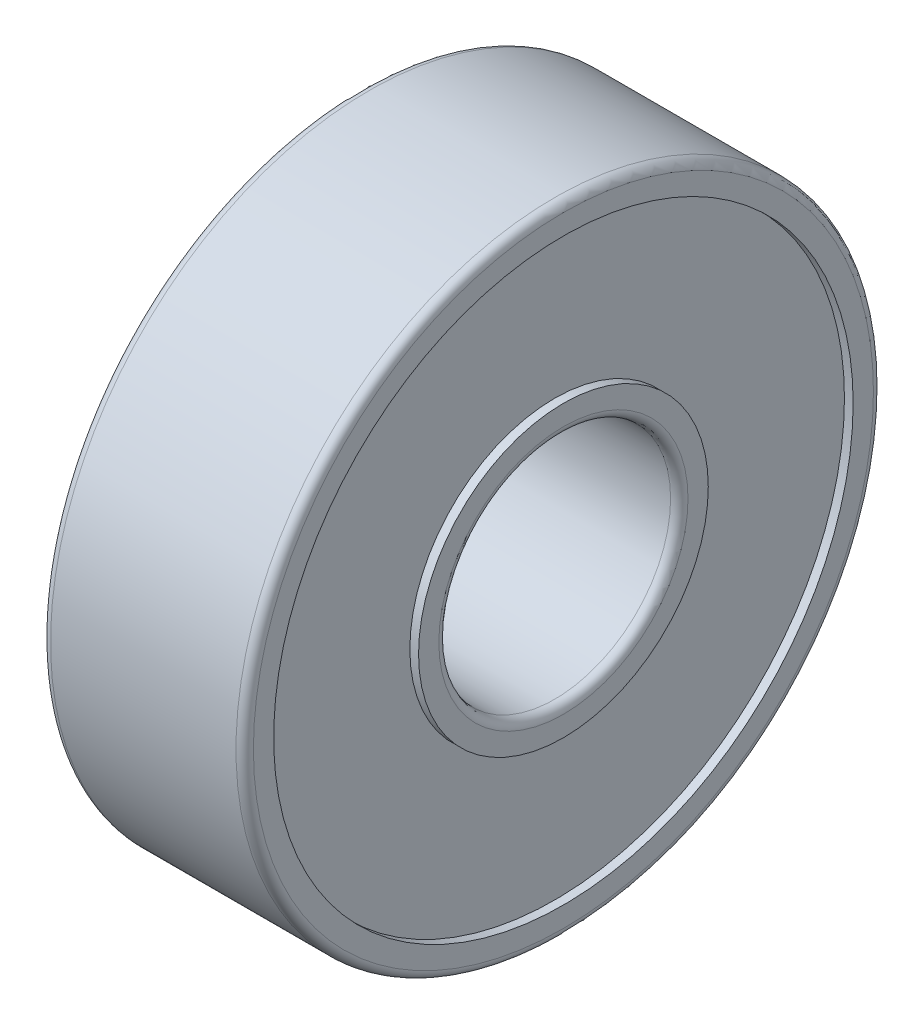
ISO-10303-21;
HEADER;
FILE_DESCRIPTION(('STEP AP214'),'2;1');
FILE_NAME('part.step','',(''),(''),'','','');
FILE_SCHEMA(('AUTOMOTIVE_DESIGN { 1 0 10303 214 1 1 1 1 }'));
ENDSEC;
DATA;
#1=APPLICATION_CONTEXT('core data for automotive mechanical design processes');
#2=APPLICATION_PROTOCOL_DEFINITION('international standard','automotive_design',2000,#1);
#3=PRODUCT_CONTEXT('',#1,'mechanical');
#4=PRODUCT('Part','Part','',(#3));
#5=PRODUCT_RELATED_PRODUCT_CATEGORY('part','',(#4));
#6=PRODUCT_DEFINITION_FORMATION('','',#4);
#7=PRODUCT_DEFINITION_CONTEXT('part definition',#1,'design');
#8=PRODUCT_DEFINITION('design','',#6,#7);
#9=PRODUCT_DEFINITION_SHAPE('','',#8);
#10=(LENGTH_UNIT() NAMED_UNIT(*) SI_UNIT(.MILLI.,.METRE.));
#11=(NAMED_UNIT(*) PLANE_ANGLE_UNIT() SI_UNIT($,.RADIAN.));
#12=(NAMED_UNIT(*) SI_UNIT($,.STERADIAN.) SOLID_ANGLE_UNIT());
#13=UNCERTAINTY_MEASURE_WITH_UNIT(LENGTH_MEASURE(1.E-05),#10,'distance_accuracy_value','');
#14=(GEOMETRIC_REPRESENTATION_CONTEXT(3) GLOBAL_UNCERTAINTY_ASSIGNED_CONTEXT((#13)) GLOBAL_UNIT_ASSIGNED_CONTEXT((#10,
#11,#12)) REPRESENTATION_CONTEXT('',''));
#15=CARTESIAN_POINT('',(0.,0.,0.));
#16=DIRECTION('',(0.,0.,1.));
#17=DIRECTION('',(1.,0.,0.));
#18=AXIS2_PLACEMENT_3D('',#15,#16,#17);
#19=CARTESIAN_POINT('',(50.,0.,0.));
#20=DIRECTION('',(1.,0.,0.));
#21=DIRECTION('',(0.,0.,-1.));
#22=AXIS2_PLACEMENT_3D('',#19,#20,#21);
#23=CYLINDRICAL_SURFACE('',#22,10.);
#24=CARTESIAN_POINT('',(-6.7,0.,0.));
#25=DIRECTION('',(-1.,0.,0.));
#26=DIRECTION('',(0.,0.,1.));
#27=AXIS2_PLACEMENT_3D('',#24,#25,#26);
#28=CIRCLE('',#27,10.);
#29=CARTESIAN_POINT('',(-6.7,0.,10.));
#30=VERTEX_POINT('',#29);
#31=EDGE_CURVE('E116',#30,#30,#28,.T.);
#32=ORIENTED_EDGE('',*,*,#31,.F.);
#33=EDGE_LOOP('',(#32));
#34=FACE_BOUND('',#33,.T.);
#35=CARTESIAN_POINT('',(-7.,0.,0.));
#36=DIRECTION('',(1.,0.,0.));
#37=DIRECTION('',(0.,0.,-1.));
#38=AXIS2_PLACEMENT_3D('',#35,#36,#37);
#39=CIRCLE('',#38,10.);
#40=CARTESIAN_POINT('',(-7.,0.,-10.));
#41=VERTEX_POINT('',#40);
#42=EDGE_CURVE('E115',#41,#41,#39,.T.);
#43=ORIENTED_EDGE('',*,*,#42,.F.);
#44=EDGE_LOOP('',(#43));
#45=FACE_BOUND('',#44,.T.);
#46=ADVANCED_FACE('F15',(#34,#45),#23,.F.);
#47=CARTESIAN_POINT('',(50.,0.,0.));
#48=DIRECTION('',(1.,0.,0.));
#49=DIRECTION('',(0.,0.,-1.));
#50=AXIS2_PLACEMENT_3D('',#47,#48,#49);
#51=CYLINDRICAL_SURFACE('',#50,5.);
#52=CARTESIAN_POINT('',(-6.7,0.,0.));
#53=DIRECTION('',(1.,0.,0.));
#54=DIRECTION('',(0.,0.,1.));
#55=AXIS2_PLACEMENT_3D('',#52,#53,#54);
#56=CIRCLE('',#55,5.);
#57=CARTESIAN_POINT('',(-6.7,0.,5.));
#58=VERTEX_POINT('',#57);
#59=EDGE_CURVE('E107',#58,#58,#56,.T.);
#60=ORIENTED_EDGE('',*,*,#59,.F.);
#61=EDGE_LOOP('',(#60));
#62=FACE_BOUND('',#61,.T.);
#63=CARTESIAN_POINT('',(-7.,0.,0.));
#64=DIRECTION('',(1.,0.,0.));
#65=DIRECTION('',(0.,0.,-1.));
#66=AXIS2_PLACEMENT_3D('',#63,#64,#65);
#67=CIRCLE('',#66,5.);
#68=CARTESIAN_POINT('',(-7.,0.,-5.));
#69=VERTEX_POINT('',#68);
#70=EDGE_CURVE('E102',#69,#69,#67,.T.);
#71=ORIENTED_EDGE('',*,*,#70,.T.);
#72=EDGE_LOOP('',(#71));
#73=FACE_BOUND('',#72,.T.);
#74=ADVANCED_FACE('F123',(#62,#73),#51,.T.);
#75=CARTESIAN_POINT('',(-7.,10.7,0.));
#76=DIRECTION('',(-1.,0.,0.));
#77=DIRECTION('',(0.,0.,1.));
#78=AXIS2_PLACEMENT_3D('',#75,#76,#77);
#79=PLANE('',#78);
#80=ORIENTED_EDGE('',*,*,#42,.T.);
#81=EDGE_LOOP('',(#80));
#82=FACE_BOUND('',#81,.T.);
#83=CARTESIAN_POINT('',(-7.,0.,0.));
#84=DIRECTION('',(1.,0.,0.));
#85=DIRECTION('',(0.,0.,-1.));
#86=AXIS2_PLACEMENT_3D('',#83,#84,#85);
#87=CIRCLE('',#86,10.6999999412019);
#88=CARTESIAN_POINT('',(-7.,0.,-10.6999999412019));
#89=VERTEX_POINT('',#88);
#90=EDGE_CURVE('E99',#89,#89,#87,.T.);
#91=ORIENTED_EDGE('',*,*,#90,.F.);
#92=EDGE_LOOP('',(#91));
#93=FACE_BOUND('',#92,.T.);
#94=ADVANCED_FACE('F127',(#82,#93),#79,.T.);
#95=CARTESIAN_POINT('',(-7.,5.,0.));
#96=DIRECTION('',(-1.,0.,0.));
#97=DIRECTION('',(0.,0.,1.));
#98=AXIS2_PLACEMENT_3D('',#95,#96,#97);
#99=PLANE('',#98);
#100=CARTESIAN_POINT('',(-7.,0.,0.));
#101=DIRECTION('',(1.,0.,0.));
#102=DIRECTION('',(0.,0.,-1.));
#103=AXIS2_PLACEMENT_3D('',#100,#101,#102);
#104=CIRCLE('',#103,4.29999999999988);
#105=CARTESIAN_POINT('',(-7.,0.,-4.29999999999988));
#106=VERTEX_POINT('',#105);
#107=EDGE_CURVE('E96',#106,#106,#104,.T.);
#108=ORIENTED_EDGE('',*,*,#107,.T.);
#109=EDGE_LOOP('',(#108));
#110=FACE_BOUND('',#109,.T.);
#111=ORIENTED_EDGE('',*,*,#70,.F.);
#112=EDGE_LOOP('',(#111));
#113=FACE_BOUND('',#112,.T.);
#114=ADVANCED_FACE('F135',(#110,#113),#99,.T.);
#115=CARTESIAN_POINT('',(-6.70000000000012,0.,0.));
#116=DIRECTION('',(1.,0.,0.));
#117=DIRECTION('',(0.,0.,-1.));
#118=AXIS2_PLACEMENT_3D('',#115,#116,#117);
#119=TOROIDAL_SURFACE('',#118,4.29999999999988,0.299999999999878);
#120=CARTESIAN_POINT('',(-6.7,0.,0.));
#121=DIRECTION('',(1.,0.,0.));
#122=DIRECTION('',(0.,0.,-1.));
#123=AXIS2_PLACEMENT_3D('',#120,#121,#122);
#124=CIRCLE('',#123,4.);
#125=CARTESIAN_POINT('',(-6.7,0.,-4.));
#126=VERTEX_POINT('',#125);
#127=EDGE_CURVE('E95',#126,#126,#124,.T.);
#128=ORIENTED_EDGE('',*,*,#127,.T.);
#129=EDGE_LOOP('',(#128));
#130=FACE_BOUND('',#129,.T.);
#131=ORIENTED_EDGE('',*,*,#107,.F.);
#132=EDGE_LOOP('',(#131));
#133=FACE_BOUND('',#132,.T.);
#134=ADVANCED_FACE('F236',(#130,#133),#119,.T.);
#135=CARTESIAN_POINT('',(50.,0.,0.));
#136=DIRECTION('',(1.,0.,0.));
#137=DIRECTION('',(0.,0.,-1.));
#138=AXIS2_PLACEMENT_3D('',#135,#136,#137);
#139=CYLINDRICAL_SURFACE('',#138,4.);
#140=CARTESIAN_POINT('',(-0.299999999999997,0.,0.));
#141=DIRECTION('',(1.,0.,0.));
#142=DIRECTION('',(0.,0.,-1.));
#143=AXIS2_PLACEMENT_3D('',#140,#141,#142);
#144=CIRCLE('',#143,4.);
#145=CARTESIAN_POINT('',(-0.299999999999997,0.,-4.));
#146=VERTEX_POINT('',#145);
#147=EDGE_CURVE('E86',#146,#146,#144,.T.);
#148=ORIENTED_EDGE('',*,*,#147,.T.);
#149=EDGE_LOOP('',(#148));
#150=FACE_BOUND('',#149,.T.);
#151=ORIENTED_EDGE('',*,*,#127,.F.);
#152=EDGE_LOOP('',(#151));
#153=FACE_BOUND('',#152,.T.);
#154=ADVANCED_FACE('F242',(#150,#153),#139,.F.);
#155=CARTESIAN_POINT('',(-0.29999999999994,0.,0.));
#156=DIRECTION('',(1.,0.,0.));
#157=DIRECTION('',(0.,0.,-1.));
#158=AXIS2_PLACEMENT_3D('',#155,#156,#157);
#159=TOROIDAL_SURFACE('',#158,4.29999999999994,0.29999999999994);
#160=CARTESIAN_POINT('',(0.,0.,0.));
#161=DIRECTION('',(1.,0.,0.));
#162=DIRECTION('',(0.,0.,-1.));
#163=AXIS2_PLACEMENT_3D('',#160,#161,#162);
#164=CIRCLE('',#163,4.29999999999994);
#165=CARTESIAN_POINT('',(0.,0.,-4.29999999999994));
#166=VERTEX_POINT('',#165);
#167=EDGE_CURVE('E81',#166,#166,#164,.T.);
#168=ORIENTED_EDGE('',*,*,#167,.T.);
#169=EDGE_LOOP('',(#168));
#170=FACE_BOUND('',#169,.T.);
#171=ORIENTED_EDGE('',*,*,#147,.F.);
#172=EDGE_LOOP('',(#171));
#173=FACE_BOUND('',#172,.T.);
#174=ADVANCED_FACE('F258',(#170,#173),#159,.T.);
#175=CARTESIAN_POINT('',(0.,4.3,0.));
#176=DIRECTION('',(1.,0.,0.));
#177=DIRECTION('',(0.,0.,-1.));
#178=AXIS2_PLACEMENT_3D('',#175,#176,#177);
#179=PLANE('',#178);
#180=CARTESIAN_POINT('',(0.,0.,0.));
#181=DIRECTION('',(1.,0.,0.));
#182=DIRECTION('',(0.,0.,-1.));
#183=AXIS2_PLACEMENT_3D('',#180,#181,#182);
#184=CIRCLE('',#183,5.);
#185=CARTESIAN_POINT('',(0.,0.,-5.));
#186=VERTEX_POINT('',#185);
#187=EDGE_CURVE('E79',#186,#186,#184,.T.);
#188=ORIENTED_EDGE('',*,*,#187,.T.);
#189=EDGE_LOOP('',(#188));
#190=FACE_BOUND('',#189,.T.);
#191=ORIENTED_EDGE('',*,*,#167,.F.);
#192=EDGE_LOOP('',(#191));
#193=FACE_BOUND('',#192,.T.);
#194=ADVANCED_FACE('F166',(#190,#193),#179,.T.);
#195=CARTESIAN_POINT('',(50.,0.,0.));
#196=DIRECTION('',(1.,0.,0.));
#197=DIRECTION('',(0.,0.,-1.));
#198=AXIS2_PLACEMENT_3D('',#195,#196,#197);
#199=CYLINDRICAL_SURFACE('',#198,5.);
#200=CARTESIAN_POINT('',(-0.299999999999997,0.,0.));
#201=DIRECTION('',(-1.,0.,0.));
#202=DIRECTION('',(0.,0.,-1.));
#203=AXIS2_PLACEMENT_3D('',#200,#201,#202);
#204=CIRCLE('',#203,5.);
#205=CARTESIAN_POINT('',(-0.299999999999997,0.,-5.));
#206=VERTEX_POINT('',#205);
#207=EDGE_CURVE('E76',#206,#206,#204,.T.);
#208=ORIENTED_EDGE('',*,*,#207,.F.);
#209=EDGE_LOOP('',(#208));
#210=FACE_BOUND('',#209,.T.);
#211=ORIENTED_EDGE('',*,*,#187,.F.);
#212=EDGE_LOOP('',(#211));
#213=FACE_BOUND('',#212,.T.);
#214=ADVANCED_FACE('F165',(#210,#213),#199,.T.);
#215=CARTESIAN_POINT('',(50.,0.,0.));
#216=DIRECTION('',(1.,0.,0.));
#217=DIRECTION('',(0.,0.,-1.));
#218=AXIS2_PLACEMENT_3D('',#215,#216,#217);
#219=CYLINDRICAL_SURFACE('',#218,10.);
#220=CARTESIAN_POINT('',(-0.299999999999997,0.,0.));
#221=DIRECTION('',(1.,0.,0.));
#222=DIRECTION('',(0.,0.,-1.));
#223=AXIS2_PLACEMENT_3D('',#220,#221,#222);
#224=CIRCLE('',#223,10.);
#225=CARTESIAN_POINT('',(-0.299999999999997,0.,-10.));
#226=VERTEX_POINT('',#225);
#227=EDGE_CURVE('E71',#226,#226,#224,.T.);
#228=ORIENTED_EDGE('',*,*,#227,.F.);
#229=EDGE_LOOP('',(#228));
#230=FACE_BOUND('',#229,.T.);
#231=CARTESIAN_POINT('',(0.,0.,0.));
#232=DIRECTION('',(1.,0.,0.));
#233=DIRECTION('',(0.,0.,-1.));
#234=AXIS2_PLACEMENT_3D('',#231,#232,#233);
#235=CIRCLE('',#234,10.);
#236=CARTESIAN_POINT('',(0.,0.,-10.));
#237=VERTEX_POINT('',#236);
#238=EDGE_CURVE('E69',#237,#237,#235,.T.);
#239=ORIENTED_EDGE('',*,*,#238,.T.);
#240=EDGE_LOOP('',(#239));
#241=FACE_BOUND('',#240,.T.);
#242=ADVANCED_FACE('F160',(#230,#241),#219,.F.);
#243=CARTESIAN_POINT('',(0.,10.,0.));
#244=DIRECTION('',(1.,0.,0.));
#245=DIRECTION('',(0.,0.,-1.));
#246=AXIS2_PLACEMENT_3D('',#243,#244,#245);
#247=PLANE('',#246);
#248=CARTESIAN_POINT('',(0.,0.,0.));
#249=DIRECTION('',(1.,0.,0.));
#250=DIRECTION('',(0.,0.,-1.));
#251=AXIS2_PLACEMENT_3D('',#248,#249,#250);
#252=CIRCLE('',#251,10.7);
#253=CARTESIAN_POINT('',(0.,0.,-10.7));
#254=VERTEX_POINT('',#253);
#255=EDGE_CURVE('E63',#254,#254,#252,.T.);
#256=ORIENTED_EDGE('',*,*,#255,.T.);
#257=EDGE_LOOP('',(#256));
#258=FACE_BOUND('',#257,.T.);
#259=ORIENTED_EDGE('',*,*,#238,.F.);
#260=EDGE_LOOP('',(#259));
#261=FACE_BOUND('',#260,.T.);
#262=ADVANCED_FACE('F151',(#258,#261),#247,.T.);
#263=CARTESIAN_POINT('',(-0.299999999999939,0.,0.));
#264=DIRECTION('',(1.,0.,0.));
#265=DIRECTION('',(0.,0.,-1.));
#266=AXIS2_PLACEMENT_3D('',#263,#264,#265);
#267=TOROIDAL_SURFACE('',#266,10.7,0.299999999999939);
#268=CARTESIAN_POINT('',(-0.3,0.,0.));
#269=DIRECTION('',(1.,0.,0.));
#270=DIRECTION('',(0.,0.,-1.));
#271=AXIS2_PLACEMENT_3D('',#268,#269,#270);
#272=CIRCLE('',#271,11.);
#273=CARTESIAN_POINT('',(-0.3,0.,-11.));
#274=VERTEX_POINT('',#273);
#275=EDGE_CURVE('E58',#274,#274,#272,.T.);
#276=ORIENTED_EDGE('',*,*,#275,.T.);
#277=EDGE_LOOP('',(#276));
#278=FACE_BOUND('',#277,.T.);
#279=ORIENTED_EDGE('',*,*,#255,.F.);
#280=EDGE_LOOP('',(#279));
#281=FACE_BOUND('',#280,.T.);
#282=ADVANCED_FACE('F144',(#278,#281),#267,.T.);
#283=CARTESIAN_POINT('',(50.,0.,0.));
#284=DIRECTION('',(1.,0.,0.));
#285=DIRECTION('',(0.,0.,-1.));
#286=AXIS2_PLACEMENT_3D('',#283,#284,#285);
#287=CYLINDRICAL_SURFACE('',#286,11.);
#288=CARTESIAN_POINT('',(-6.7,0.,0.));
#289=DIRECTION('',(1.,0.,0.));
#290=DIRECTION('',(0.,0.,-1.));
#291=AXIS2_PLACEMENT_3D('',#288,#289,#290);
#292=CIRCLE('',#291,11.);
#293=CARTESIAN_POINT('',(-6.7,0.,-11.));
#294=VERTEX_POINT('',#293);
#295=EDGE_CURVE('E57',#294,#294,#292,.T.);
#296=ORIENTED_EDGE('',*,*,#295,.T.);
#297=EDGE_LOOP('',(#296));
#298=FACE_BOUND('',#297,.T.);
#299=ORIENTED_EDGE('',*,*,#275,.F.);
#300=EDGE_LOOP('',(#299));
#301=FACE_BOUND('',#300,.T.);
#302=ADVANCED_FACE('F136',(#298,#301),#287,.T.);
#303=CARTESIAN_POINT('',(-6.70000000000013,0.,0.));
#304=DIRECTION('',(1.,0.,0.));
#305=DIRECTION('',(0.,0.,-1.));
#306=AXIS2_PLACEMENT_3D('',#303,#304,#305);
#307=TOROIDAL_SURFACE('',#306,10.7000000000001,0.299999999999875);
#308=ORIENTED_EDGE('',*,*,#90,.T.);
#309=EDGE_LOOP('',(#308));
#310=FACE_BOUND('',#309,.T.);
#311=ORIENTED_EDGE('',*,*,#295,.F.);
#312=EDGE_LOOP('',(#311));
#313=FACE_BOUND('',#312,.T.);
#314=ADVANCED_FACE('F137',(#310,#313),#307,.T.);
#315=CARTESIAN_POINT('',(-6.7,10.,0.));
#316=DIRECTION('',(-1.,0.,0.));
#317=DIRECTION('',(0.,0.,1.));
#318=AXIS2_PLACEMENT_3D('',#315,#316,#317);
#319=PLANE('',#318);
#320=ORIENTED_EDGE('',*,*,#59,.T.);
#321=EDGE_LOOP('',(#320));
#322=FACE_BOUND('',#321,.T.);
#323=ORIENTED_EDGE('',*,*,#31,.T.);
#324=EDGE_LOOP('',(#323));
#325=FACE_BOUND('',#324,.T.);
#326=ADVANCED_FACE('F122',(#322,#325),#319,.T.);
#327=CARTESIAN_POINT('',(-0.3,5.,0.));
#328=DIRECTION('',(1.,0.,0.));
#329=DIRECTION('',(0.,0.,-1.));
#330=AXIS2_PLACEMENT_3D('',#327,#328,#329);
#331=PLANE('',#330);
#332=ORIENTED_EDGE('',*,*,#227,.T.);
#333=EDGE_LOOP('',(#332));
#334=FACE_BOUND('',#333,.T.);
#335=ORIENTED_EDGE('',*,*,#207,.T.);
#336=EDGE_LOOP('',(#335));
#337=FACE_BOUND('',#336,.T.);
#338=ADVANCED_FACE('F180',(#334,#337),#331,.T.);
#339=CLOSED_SHELL('',(#46,#74,#94,#114,#134,#154,#174,#194,#214,#242,#262,#282,#302,#314,#326,#338));
#340=CARTESIAN_POINT('',(-6.4,5.,0.));
#341=DIRECTION('',(1.,0.,0.));
#342=DIRECTION('',(0.,0.,-1.));
#343=AXIS2_PLACEMENT_3D('',#340,#341,#342);
#344=PLANE('',#343);
#345=CARTESIAN_POINT('',(-6.4,0.,0.));
#346=DIRECTION('',(1.,0.,0.));
#347=DIRECTION('',(0.,0.,-1.));
#348=AXIS2_PLACEMENT_3D('',#345,#346,#347);
#349=CIRCLE('',#348,10.);
#350=CARTESIAN_POINT('',(-6.4,0.,-10.));
#351=VERTEX_POINT('',#350);
#352=EDGE_CURVE('E55',#351,#351,#349,.T.);
#353=ORIENTED_EDGE('',*,*,#352,.T.);
#354=EDGE_LOOP('',(#353));
#355=FACE_BOUND('',#354,.T.);
#356=CARTESIAN_POINT('',(-6.4,0.,0.));
#357=DIRECTION('',(-1.,0.,0.));
#358=DIRECTION('',(0.,0.,-1.));
#359=AXIS2_PLACEMENT_3D('',#356,#357,#358);
#360=CIRCLE('',#359,5.);
#361=CARTESIAN_POINT('',(-6.4,0.,-5.));
#362=VERTEX_POINT('',#361);
#363=EDGE_CURVE('E48',#362,#362,#360,.T.);
#364=ORIENTED_EDGE('',*,*,#363,.T.);
#365=EDGE_LOOP('',(#364));
#366=FACE_BOUND('',#365,.T.);
#367=ADVANCED_FACE('F181',(#355,#366),#344,.T.);
#368=CARTESIAN_POINT('',(50.,0.,0.));
#369=DIRECTION('',(1.,0.,0.));
#370=DIRECTION('',(0.,0.,-1.));
#371=AXIS2_PLACEMENT_3D('',#368,#369,#370);
#372=CYLINDRICAL_SURFACE('',#371,10.);
#373=ORIENTED_EDGE('',*,*,#352,.F.);
#374=EDGE_LOOP('',(#373));
#375=FACE_BOUND('',#374,.T.);
#376=CARTESIAN_POINT('',(-4.7609520212919,0.,0.));
#377=DIRECTION('',(1.,0.,0.));
#378=DIRECTION('',(0.,0.,-1.));
#379=AXIS2_PLACEMENT_3D('',#376,#377,#378);
#380=CIRCLE('',#379,10.);
#381=CARTESIAN_POINT('',(-4.7609520212919,0.,-10.));
#382=VERTEX_POINT('',#381);
#383=EDGE_CURVE('E42',#382,#382,#380,.T.);
#384=ORIENTED_EDGE('',*,*,#383,.T.);
#385=EDGE_LOOP('',(#384));
#386=FACE_BOUND('',#385,.T.);
#387=ADVANCED_FACE('F184',(#375,#386),#372,.F.);
#388=CARTESIAN_POINT('',(-3.49999999999996,0.,0.));
#389=DIRECTION('',(1.,0.,0.));
#390=DIRECTION('',(0.,0.,-1.));
#391=AXIS2_PLACEMENT_3D('',#388,#389,#390);
#392=TOROIDAL_SURFACE('',#391,7.5,2.80000000000004);
#393=CARTESIAN_POINT('',(-4.7609520212919,0.,0.));
#394=DIRECTION('',(1.,0.,0.));
#395=DIRECTION('',(0.,0.,-1.));
#396=AXIS2_PLACEMENT_3D('',#393,#394,#395);
#397=CIRCLE('',#396,5.);
#398=CARTESIAN_POINT('',(-4.7609520212919,0.,-5.));
#399=VERTEX_POINT('',#398);
#400=EDGE_CURVE('E37',#399,#399,#397,.T.);
#401=ORIENTED_EDGE('',*,*,#400,.T.);
#402=EDGE_LOOP('',(#401));
#403=FACE_BOUND('',#402,.T.);
#404=ORIENTED_EDGE('',*,*,#383,.F.);
#405=EDGE_LOOP('',(#404));
#406=FACE_BOUND('',#405,.T.);
#407=ADVANCED_FACE('F189',(#403,#406),#392,.T.);
#408=CARTESIAN_POINT('',(50.,0.,0.));
#409=DIRECTION('',(1.,0.,0.));
#410=DIRECTION('',(0.,0.,-1.));
#411=AXIS2_PLACEMENT_3D('',#408,#409,#410);
#412=CYLINDRICAL_SURFACE('',#411,5.);
#413=ORIENTED_EDGE('',*,*,#363,.F.);
#414=EDGE_LOOP('',(#413));
#415=FACE_BOUND('',#414,.T.);
#416=ORIENTED_EDGE('',*,*,#400,.F.);
#417=EDGE_LOOP('',(#416));
#418=FACE_BOUND('',#417,.T.);
#419=ADVANCED_FACE('F191',(#415,#418),#412,.T.);
#420=CLOSED_SHELL('',(#367,#387,#407,#419));
#421=CARTESIAN_POINT('',(-0.6,10.,0.));
#422=DIRECTION('',(-1.,0.,0.));
#423=DIRECTION('',(0.,0.,1.));
#424=AXIS2_PLACEMENT_3D('',#421,#422,#423);
#425=PLANE('',#424);
#426=CARTESIAN_POINT('',(-0.600000000000001,0.,0.));
#427=DIRECTION('',(1.,0.,0.));
#428=DIRECTION('',(0.,0.,1.));
#429=AXIS2_PLACEMENT_3D('',#426,#427,#428);
#430=CIRCLE('',#429,5.);
#431=CARTESIAN_POINT('',(-0.600000000000001,0.,5.));
#432=VERTEX_POINT('',#431);
#433=EDGE_CURVE('E35',#432,#432,#430,.T.);
#434=ORIENTED_EDGE('',*,*,#433,.T.);
#435=EDGE_LOOP('',(#434));
#436=FACE_BOUND('',#435,.T.);
#437=CARTESIAN_POINT('',(-0.600000000000001,0.,0.));
#438=DIRECTION('',(-1.,0.,0.));
#439=DIRECTION('',(0.,0.,1.));
#440=AXIS2_PLACEMENT_3D('',#437,#438,#439);
#441=CIRCLE('',#440,10.);
#442=CARTESIAN_POINT('',(-0.600000000000001,0.,10.));
#443=VERTEX_POINT('',#442);
#444=EDGE_CURVE('E26',#443,#443,#441,.T.);
#445=ORIENTED_EDGE('',*,*,#444,.T.);
#446=EDGE_LOOP('',(#445));
#447=FACE_BOUND('',#446,.T.);
#448=ADVANCED_FACE('F200',(#436,#447),#425,.T.);
#449=CARTESIAN_POINT('',(50.,0.,0.));
#450=DIRECTION('',(1.,0.,0.));
#451=DIRECTION('',(0.,0.,-1.));
#452=AXIS2_PLACEMENT_3D('',#449,#450,#451);
#453=CYLINDRICAL_SURFACE('',#452,5.);
#454=ORIENTED_EDGE('',*,*,#433,.F.);
#455=EDGE_LOOP('',(#454));
#456=FACE_BOUND('',#455,.T.);
#457=CARTESIAN_POINT('',(-2.2390479787081,0.,0.));
#458=DIRECTION('',(1.,0.,0.));
#459=DIRECTION('',(0.,0.,-1.));
#460=AXIS2_PLACEMENT_3D('',#457,#458,#459);
#461=CIRCLE('',#460,5.);
#462=CARTESIAN_POINT('',(-2.2390479787081,0.,-5.));
#463=VERTEX_POINT('',#462);
#464=EDGE_CURVE('E23',#463,#463,#461,.T.);
#465=ORIENTED_EDGE('',*,*,#464,.T.);
#466=EDGE_LOOP('',(#465));
#467=FACE_BOUND('',#466,.T.);
#468=ADVANCED_FACE('F205',(#456,#467),#453,.T.);
#469=CARTESIAN_POINT('',(-3.5,0.,0.));
#470=DIRECTION('',(1.,0.,0.));
#471=DIRECTION('',(0.,0.,-1.));
#472=AXIS2_PLACEMENT_3D('',#469,#470,#471);
#473=TOROIDAL_SURFACE('',#472,7.5,2.80000000000004);
#474=CARTESIAN_POINT('',(-2.2390479787081,0.,0.));
#475=DIRECTION('',(1.,0.,0.));
#476=DIRECTION('',(0.,0.,-1.));
#477=AXIS2_PLACEMENT_3D('',#474,#475,#476);
#478=CIRCLE('',#477,10.);
#479=CARTESIAN_POINT('',(-2.2390479787081,0.,-10.));
#480=VERTEX_POINT('',#479);
#481=EDGE_CURVE('E10',#480,#480,#478,.T.);
#482=ORIENTED_EDGE('',*,*,#481,.T.);
#483=EDGE_LOOP('',(#482));
#484=FACE_BOUND('',#483,.T.);
#485=ORIENTED_EDGE('',*,*,#464,.F.);
#486=EDGE_LOOP('',(#485));
#487=FACE_BOUND('',#486,.T.);
#488=ADVANCED_FACE('F210',(#484,#487),#473,.T.);
#489=CARTESIAN_POINT('',(50.,0.,0.));
#490=DIRECTION('',(1.,0.,0.));
#491=DIRECTION('',(0.,0.,-1.));
#492=AXIS2_PLACEMENT_3D('',#489,#490,#491);
#493=CYLINDRICAL_SURFACE('',#492,10.);
#494=ORIENTED_EDGE('',*,*,#444,.F.);
#495=EDGE_LOOP('',(#494));
#496=FACE_BOUND('',#495,.T.);
#497=ORIENTED_EDGE('',*,*,#481,.F.);
#498=EDGE_LOOP('',(#497));
#499=FACE_BOUND('',#498,.T.);
#500=ADVANCED_FACE('F17',(#496,#499),#493,.F.);
#501=CLOSED_SHELL('',(#448,#468,#488,#500));
#502=ORIENTED_CLOSED_SHELL('',*,#420,.T.);
#503=ORIENTED_CLOSED_SHELL('',*,#501,.T.);
#504=BREP_WITH_VOIDS('B1',#339,(#502,#503));
#505=ADVANCED_BREP_SHAPE_REPRESENTATION('',(#18,#504),#14);
#506=SHAPE_DEFINITION_REPRESENTATION(#9,#505);
ENDSEC;
END-ISO-10303-21;
